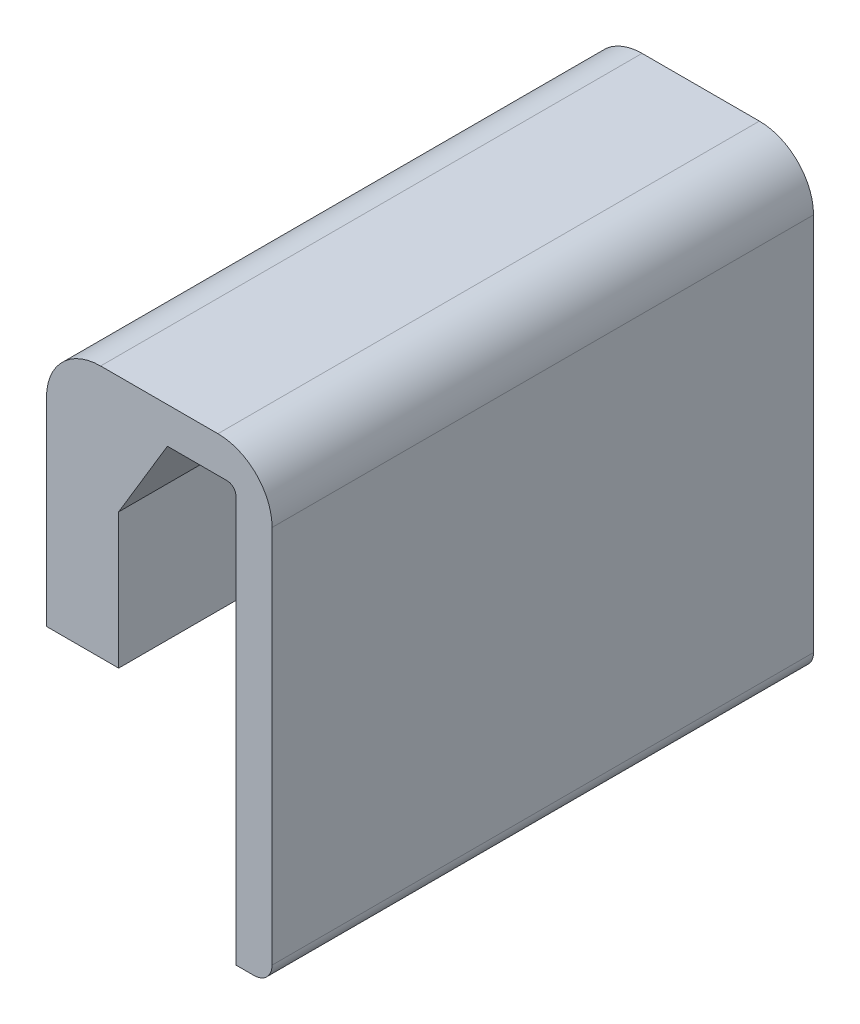
ISO-10303-21;
HEADER;
FILE_DESCRIPTION(('STEP AP214'),'2;1');
FILE_NAME('part.step','',(''),(''),'','','');
FILE_SCHEMA(('AUTOMOTIVE_DESIGN { 1 0 10303 214 1 1 1 1 }'));
ENDSEC;
DATA;
#1=APPLICATION_CONTEXT('core data for automotive mechanical design processes');
#2=APPLICATION_PROTOCOL_DEFINITION('international standard','automotive_design',2000,#1);
#3=PRODUCT_CONTEXT('',#1,'mechanical');
#4=PRODUCT('Part','Part','',(#3));
#5=PRODUCT_RELATED_PRODUCT_CATEGORY('part','',(#4));
#6=PRODUCT_DEFINITION_FORMATION('','',#4);
#7=PRODUCT_DEFINITION_CONTEXT('part definition',#1,'design');
#8=PRODUCT_DEFINITION('design','',#6,#7);
#9=PRODUCT_DEFINITION_SHAPE('','',#8);
#10=(LENGTH_UNIT() NAMED_UNIT(*) SI_UNIT(.MILLI.,.METRE.));
#11=(NAMED_UNIT(*) PLANE_ANGLE_UNIT() SI_UNIT($,.RADIAN.));
#12=(NAMED_UNIT(*) SI_UNIT($,.STERADIAN.) SOLID_ANGLE_UNIT());
#13=UNCERTAINTY_MEASURE_WITH_UNIT(LENGTH_MEASURE(1.E-05),#10,'distance_accuracy_value','');
#14=(GEOMETRIC_REPRESENTATION_CONTEXT(3) GLOBAL_UNCERTAINTY_ASSIGNED_CONTEXT((#13)) GLOBAL_UNIT_ASSIGNED_CONTEXT((#10,
#11,#12)) REPRESENTATION_CONTEXT('',''));
#15=CARTESIAN_POINT('',(0.,0.,0.));
#16=DIRECTION('',(0.,0.,1.));
#17=DIRECTION('',(1.,0.,0.));
#18=AXIS2_PLACEMENT_3D('',#15,#16,#17);
#19=CARTESIAN_POINT('',(3.99999999999999,43.5,30.));
#20=DIRECTION('',(-1.,0.,0.));
#21=DIRECTION('',(0.,-1.,0.));
#22=AXIS2_PLACEMENT_3D('',#19,#20,#21);
#23=PLANE('',#22);
#24=DIRECTION('',(0.,-0.948683298050514,0.316227766016838));
#25=VECTOR('',#24,1.);
#26=CARTESIAN_POINT('',(4.,37.35,11.55));
#27=LINE('',#26,#25);
#28=CARTESIAN_POINT('',(3.99999999999999,42.,10.));
#29=VERTEX_POINT('',#28);
#30=CARTESIAN_POINT('',(3.99999999999999,36.,12.));
#31=VERTEX_POINT('',#30);
#32=EDGE_CURVE('E191',#29,#31,#27,.T.);
#33=ORIENTED_EDGE('',*,*,#32,.T.);
#34=DIRECTION('',(0.,0.,-1.));
#35=VECTOR('',#34,1.);
#36=CARTESIAN_POINT('',(4.,36.,30.));
#37=LINE('',#36,#35);
#38=CARTESIAN_POINT('',(4.,36.,0.));
#39=VERTEX_POINT('',#38);
#40=EDGE_CURVE('E249',#31,#39,#37,.T.);
#41=ORIENTED_EDGE('',*,*,#40,.T.);
#42=DIRECTION('',(0.,1.,0.));
#43=VECTOR('',#42,1.);
#44=CARTESIAN_POINT('',(3.99999999999999,43.5,0.));
#45=LINE('',#44,#43);
#46=CARTESIAN_POINT('',(3.99999999999999,43.5,0.));
#47=VERTEX_POINT('',#46);
#48=EDGE_CURVE('E188',#39,#47,#45,.T.);
#49=ORIENTED_EDGE('',*,*,#48,.T.);
#50=DIRECTION('',(0.,0.,-1.));
#51=VECTOR('',#50,1.);
#52=CARTESIAN_POINT('',(3.99999999999999,43.5,30.));
#53=LINE('',#52,#51);
#54=CARTESIAN_POINT('',(3.99999999999999,43.5,30.));
#55=VERTEX_POINT('',#54);
#56=EDGE_CURVE('E210',#55,#47,#53,.T.);
#57=ORIENTED_EDGE('',*,*,#56,.F.);
#58=DIRECTION('',(0.,1.,0.));
#59=VECTOR('',#58,1.);
#60=CARTESIAN_POINT('',(3.99999999999999,43.5,30.));
#61=LINE('',#60,#59);
#62=CARTESIAN_POINT('',(4.,36.,30.));
#63=VERTEX_POINT('',#62);
#64=EDGE_CURVE('E206',#63,#55,#61,.T.);
#65=ORIENTED_EDGE('',*,*,#64,.F.);
#66=DIRECTION('',(0.,0.,-1.));
#67=VECTOR('',#66,1.);
#68=CARTESIAN_POINT('',(4.,36.,30.));
#69=LINE('',#68,#67);
#70=CARTESIAN_POINT('',(4.,36.,18.));
#71=VERTEX_POINT('',#70);
#72=EDGE_CURVE('E159',#63,#71,#69,.T.);
#73=ORIENTED_EDGE('',*,*,#72,.T.);
#74=DIRECTION('',(0.,0.948683298050514,0.316227766016838));
#75=VECTOR('',#74,1.);
#76=CARTESIAN_POINT('',(3.99999999999999,46.35,21.45));
#77=LINE('',#76,#75);
#78=CARTESIAN_POINT('',(4.,42.,20.));
#79=VERTEX_POINT('',#78);
#80=EDGE_CURVE('E316',#71,#79,#77,.T.);
#81=ORIENTED_EDGE('',*,*,#80,.T.);
#82=DIRECTION('',(0.,0.,-1.));
#83=VECTOR('',#82,1.);
#84=CARTESIAN_POINT('',(3.99999999999999,42.,30.));
#85=LINE('',#84,#83);
#86=EDGE_CURVE('E319',#79,#29,#85,.T.);
#87=ORIENTED_EDGE('',*,*,#86,.T.);
#88=EDGE_LOOP('',(#33,#41,#49,#57,#65,#73,#81,#87));
#89=FACE_BOUND('',#88,.T.);
#90=ADVANCED_FACE('F33',(#89),#23,.F.);
#91=CARTESIAN_POINT('',(6.69999999999999,48.,30.));
#92=DIRECTION('',(-0.857492925712544,0.514495755427527,0.));
#93=DIRECTION('',(-0.514495755427527,-0.857492925712544,0.));
#94=AXIS2_PLACEMENT_3D('',#91,#92,#93);
#95=PLANE('',#94);
#96=DIRECTION('',(0.514495755427527,0.857492925712544,0.));
#97=VECTOR('',#96,1.);
#98=CARTESIAN_POINT('',(6.69999999999999,48.,0.));
#99=LINE('',#98,#97);
#100=CARTESIAN_POINT('',(6.69999999999999,48.,0.));
#101=VERTEX_POINT('',#100);
#102=EDGE_CURVE('E190',#47,#101,#99,.T.);
#103=ORIENTED_EDGE('',*,*,#102,.T.);
#104=DIRECTION('',(0.,0.,-1.));
#105=VECTOR('',#104,1.);
#106=CARTESIAN_POINT('',(6.69999999999999,48.,30.));
#107=LINE('',#106,#105);
#108=CARTESIAN_POINT('',(6.69999999999999,48.,30.));
#109=VERTEX_POINT('',#108);
#110=EDGE_CURVE('E182',#109,#101,#107,.T.);
#111=ORIENTED_EDGE('',*,*,#110,.F.);
#112=DIRECTION('',(0.514495755427527,0.857492925712544,0.));
#113=VECTOR('',#112,1.);
#114=CARTESIAN_POINT('',(6.69999999999999,48.,30.));
#115=LINE('',#114,#113);
#116=EDGE_CURVE('E275',#55,#109,#115,.T.);
#117=ORIENTED_EDGE('',*,*,#116,.F.);
#118=ORIENTED_EDGE('',*,*,#56,.T.);
#119=EDGE_LOOP('',(#103,#111,#117,#118));
#120=FACE_BOUND('',#119,.T.);
#121=ADVANCED_FACE('F265',(#120),#95,.F.);
#122=CARTESIAN_POINT('',(10.5,48.,30.));
#123=DIRECTION('',(0.,1.,0.));
#124=DIRECTION('',(0.,0.,1.));
#125=AXIS2_PLACEMENT_3D('',#122,#123,#124);
#126=PLANE('',#125);
#127=DIRECTION('',(1.,0.,0.));
#128=VECTOR('',#127,1.);
#129=CARTESIAN_POINT('',(10.5,48.,0.));
#130=LINE('',#129,#128);
#131=CARTESIAN_POINT('',(9.99999999999999,48.,0.));
#132=VERTEX_POINT('',#131);
#133=EDGE_CURVE('E193',#101,#132,#130,.T.);
#134=ORIENTED_EDGE('',*,*,#133,.T.);
#135=DIRECTION('',(0.,0.,-1.));
#136=VECTOR('',#135,1.);
#137=CARTESIAN_POINT('',(9.99999999999999,48.,30.));
#138=LINE('',#137,#136);
#139=CARTESIAN_POINT('',(9.99999999999999,48.,30.));
#140=VERTEX_POINT('',#139);
#141=EDGE_CURVE('E234',#132,#140,#138,.F.);
#142=ORIENTED_EDGE('',*,*,#141,.T.);
#143=DIRECTION('',(1.,0.,0.));
#144=VECTOR('',#143,1.);
#145=CARTESIAN_POINT('',(10.5,48.,30.));
#146=LINE('',#145,#144);
#147=EDGE_CURVE('E272',#109,#140,#146,.T.);
#148=ORIENTED_EDGE('',*,*,#147,.F.);
#149=ORIENTED_EDGE('',*,*,#110,.T.);
#150=EDGE_LOOP('',(#134,#142,#148,#149));
#151=FACE_BOUND('',#150,.T.);
#152=ADVANCED_FACE('F269',(#151),#126,.F.);
#153=CARTESIAN_POINT('',(10.5,25.,30.));
#154=DIRECTION('',(1.,0.,0.));
#155=DIRECTION('',(0.,1.,0.));
#156=AXIS2_PLACEMENT_3D('',#153,#154,#155);
#157=PLANE('',#156);
#158=DIRECTION('',(0.,-1.,0.));
#159=VECTOR('',#158,1.);
#160=CARTESIAN_POINT('',(10.5,25.,30.));
#161=LINE('',#160,#159);
#162=CARTESIAN_POINT('',(10.5,47.5,30.));
#163=VERTEX_POINT('',#162);
#164=CARTESIAN_POINT('',(10.5,25.,30.));
#165=VERTEX_POINT('',#164);
#166=EDGE_CURVE('E274',#163,#165,#161,.T.);
#167=ORIENTED_EDGE('',*,*,#166,.F.);
#168=DIRECTION('',(0.,0.,-1.));
#169=VECTOR('',#168,1.);
#170=CARTESIAN_POINT('',(10.5,47.5,0.));
#171=LINE('',#170,#169);
#172=CARTESIAN_POINT('',(10.5,47.5,0.));
#173=VERTEX_POINT('',#172);
#174=EDGE_CURVE('E231',#163,#173,#171,.T.);
#175=ORIENTED_EDGE('',*,*,#174,.T.);
#176=DIRECTION('',(0.,-1.,0.));
#177=VECTOR('',#176,1.);
#178=CARTESIAN_POINT('',(10.5,25.,0.));
#179=LINE('',#178,#177);
#180=CARTESIAN_POINT('',(10.5,25.,0.));
#181=VERTEX_POINT('',#180);
#182=EDGE_CURVE('E196',#173,#181,#179,.T.);
#183=ORIENTED_EDGE('',*,*,#182,.T.);
#184=DIRECTION('',(0.,0.,-1.));
#185=VECTOR('',#184,1.);
#186=CARTESIAN_POINT('',(10.5,25.,30.));
#187=LINE('',#186,#185);
#188=EDGE_CURVE('E178',#165,#181,#187,.T.);
#189=ORIENTED_EDGE('',*,*,#188,.F.);
#190=EDGE_LOOP('',(#167,#175,#183,#189));
#191=FACE_BOUND('',#190,.T.);
#192=ADVANCED_FACE('F361',(#191),#157,.F.);
#193=CARTESIAN_POINT('',(12.5,25.,30.));
#194=DIRECTION('',(0.,1.,0.));
#195=DIRECTION('',(0.,0.,1.));
#196=AXIS2_PLACEMENT_3D('',#193,#194,#195);
#197=PLANE('',#196);
#198=DIRECTION('',(1.,0.,0.));
#199=VECTOR('',#198,1.);
#200=CARTESIAN_POINT('',(12.5,25.,0.));
#201=LINE('',#200,#199);
#202=CARTESIAN_POINT('',(11.5,25.,0.));
#203=VERTEX_POINT('',#202);
#204=EDGE_CURVE('E198',#181,#203,#201,.T.);
#205=ORIENTED_EDGE('',*,*,#204,.T.);
#206=DIRECTION('',(0.,0.,-1.));
#207=VECTOR('',#206,1.);
#208=CARTESIAN_POINT('',(11.5,25.,30.));
#209=LINE('',#208,#207);
#210=CARTESIAN_POINT('',(11.5,25.,30.));
#211=VERTEX_POINT('',#210);
#212=EDGE_CURVE('E56',#203,#211,#209,.F.);
#213=ORIENTED_EDGE('',*,*,#212,.T.);
#214=DIRECTION('',(1.,0.,0.));
#215=VECTOR('',#214,1.);
#216=CARTESIAN_POINT('',(12.5,25.,30.));
#217=LINE('',#216,#215);
#218=EDGE_CURVE('E277',#165,#211,#217,.T.);
#219=ORIENTED_EDGE('',*,*,#218,.F.);
#220=ORIENTED_EDGE('',*,*,#188,.T.);
#221=EDGE_LOOP('',(#205,#213,#219,#220));
#222=FACE_BOUND('',#221,.T.);
#223=ADVANCED_FACE('F364',(#222),#197,.F.);
#224=CARTESIAN_POINT('',(12.5,50.,30.));
#225=DIRECTION('',(-1.,0.,0.));
#226=DIRECTION('',(0.,-1.,0.));
#227=AXIS2_PLACEMENT_3D('',#224,#225,#226);
#228=PLANE('',#227);
#229=DIRECTION('',(0.,1.,0.));
#230=VECTOR('',#229,1.);
#231=CARTESIAN_POINT('',(12.5,50.,30.));
#232=LINE('',#231,#230);
#233=CARTESIAN_POINT('',(12.5,26.,30.));
#234=VERTEX_POINT('',#233);
#235=CARTESIAN_POINT('',(12.5,47.,30.));
#236=VERTEX_POINT('',#235);
#237=EDGE_CURVE('E184',#234,#236,#232,.T.);
#238=ORIENTED_EDGE('',*,*,#237,.F.);
#239=DIRECTION('',(0.,0.,-1.));
#240=VECTOR('',#239,1.);
#241=CARTESIAN_POINT('',(12.5,26.,30.));
#242=LINE('',#241,#240);
#243=CARTESIAN_POINT('',(12.5,26.,0.));
#244=VERTEX_POINT('',#243);
#245=EDGE_CURVE('E240',#234,#244,#242,.T.);
#246=ORIENTED_EDGE('',*,*,#245,.T.);
#247=DIRECTION('',(0.,1.,0.));
#248=VECTOR('',#247,1.);
#249=CARTESIAN_POINT('',(12.5,50.,0.));
#250=LINE('',#249,#248);
#251=CARTESIAN_POINT('',(12.5,47.,0.));
#252=VERTEX_POINT('',#251);
#253=EDGE_CURVE('E200',#244,#252,#250,.T.);
#254=ORIENTED_EDGE('',*,*,#253,.T.);
#255=DIRECTION('',(0.,0.,-1.));
#256=VECTOR('',#255,1.);
#257=CARTESIAN_POINT('',(12.5,47.,30.));
#258=LINE('',#257,#256);
#259=EDGE_CURVE('E223',#252,#236,#258,.F.);
#260=ORIENTED_EDGE('',*,*,#259,.T.);
#261=EDGE_LOOP('',(#238,#246,#254,#260));
#262=FACE_BOUND('',#261,.T.);
#263=ADVANCED_FACE('F289',(#262),#228,.F.);
#264=CARTESIAN_POINT('',(0.,50.,30.));
#265=DIRECTION('',(0.,-1.,0.));
#266=DIRECTION('',(0.,0.,-1.));
#267=AXIS2_PLACEMENT_3D('',#264,#265,#266);
#268=PLANE('',#267);
#269=DIRECTION('',(-1.,0.,0.));
#270=VECTOR('',#269,1.);
#271=CARTESIAN_POINT('',(0.,50.,30.));
#272=LINE('',#271,#270);
#273=CARTESIAN_POINT('',(9.49999999999999,50.,30.));
#274=VERTEX_POINT('',#273);
#275=CARTESIAN_POINT('',(3.,50.,30.));
#276=VERTEX_POINT('',#275);
#277=EDGE_CURVE('E179',#274,#276,#272,.T.);
#278=ORIENTED_EDGE('',*,*,#277,.F.);
#279=DIRECTION('',(0.,0.,-1.));
#280=VECTOR('',#279,1.);
#281=CARTESIAN_POINT('',(9.49999999999999,50.,30.));
#282=LINE('',#281,#280);
#283=CARTESIAN_POINT('',(9.49999999999999,50.,0.));
#284=VERTEX_POINT('',#283);
#285=EDGE_CURVE('E215',#274,#284,#282,.T.);
#286=ORIENTED_EDGE('',*,*,#285,.T.);
#287=DIRECTION('',(-1.,0.,0.));
#288=VECTOR('',#287,1.);
#289=CARTESIAN_POINT('',(0.,50.,0.));
#290=LINE('',#289,#288);
#291=CARTESIAN_POINT('',(3.,50.,0.));
#292=VERTEX_POINT('',#291);
#293=EDGE_CURVE('E202',#284,#292,#290,.T.);
#294=ORIENTED_EDGE('',*,*,#293,.T.);
#295=DIRECTION('',(0.,0.,-1.));
#296=VECTOR('',#295,1.);
#297=CARTESIAN_POINT('',(3.,50.,30.));
#298=LINE('',#297,#296);
#299=EDGE_CURVE('E213',#292,#276,#298,.F.);
#300=ORIENTED_EDGE('',*,*,#299,.T.);
#301=EDGE_LOOP('',(#278,#286,#294,#300));
#302=FACE_BOUND('',#301,.T.);
#303=ADVANCED_FACE('F296',(#302),#268,.F.);
#304=CARTESIAN_POINT('',(0.,0.,30.));
#305=DIRECTION('',(1.,0.,0.));
#306=DIRECTION('',(0.,0.,-1.));
#307=AXIS2_PLACEMENT_3D('',#304,#305,#306);
#308=PLANE('',#307);
#309=DIRECTION('',(0.,-1.,0.));
#310=VECTOR('',#309,1.);
#311=CARTESIAN_POINT('',(0.,0.,0.));
#312=LINE('',#311,#310);
#313=CARTESIAN_POINT('',(0.,47.,0.));
#314=VERTEX_POINT('',#313);
#315=CARTESIAN_POINT('',(0.,36.,0.));
#316=VERTEX_POINT('',#315);
#317=EDGE_CURVE('E205',#314,#316,#312,.T.);
#318=ORIENTED_EDGE('',*,*,#317,.T.);
#319=DIRECTION('',(0.,0.,-1.));
#320=VECTOR('',#319,1.);
#321=CARTESIAN_POINT('',(0.,36.,0.));
#322=LINE('',#321,#320);
#323=CARTESIAN_POINT('',(0.,36.,12.));
#324=VERTEX_POINT('',#323);
#325=EDGE_CURVE('E48',#324,#316,#322,.T.);
#326=ORIENTED_EDGE('',*,*,#325,.F.);
#327=DIRECTION('',(0.,-0.948683298050514,0.316227766016838));
#328=VECTOR('',#327,1.);
#329=CARTESIAN_POINT('',(0.,36.,12.));
#330=LINE('',#329,#328);
#331=CARTESIAN_POINT('',(0.,42.,10.));
#332=VERTEX_POINT('',#331);
#333=EDGE_CURVE('E302',#332,#324,#330,.T.);
#334=ORIENTED_EDGE('',*,*,#333,.F.);
#335=DIRECTION('',(0.,0.,-1.));
#336=VECTOR('',#335,1.);
#337=CARTESIAN_POINT('',(0.,42.,10.));
#338=LINE('',#337,#336);
#339=CARTESIAN_POINT('',(0.,42.,20.));
#340=VERTEX_POINT('',#339);
#341=EDGE_CURVE('E307',#340,#332,#338,.T.);
#342=ORIENTED_EDGE('',*,*,#341,.F.);
#343=DIRECTION('',(0.,0.948683298050514,0.316227766016838));
#344=VECTOR('',#343,1.);
#345=CARTESIAN_POINT('',(0.,36.,18.));
#346=LINE('',#345,#344);
#347=CARTESIAN_POINT('',(0.,36.,18.));
#348=VERTEX_POINT('',#347);
#349=EDGE_CURVE('E172',#348,#340,#346,.T.);
#350=ORIENTED_EDGE('',*,*,#349,.F.);
#351=DIRECTION('',(0.,0.,-1.));
#352=VECTOR('',#351,1.);
#353=CARTESIAN_POINT('',(0.,36.,18.));
#354=LINE('',#353,#352);
#355=CARTESIAN_POINT('',(0.,36.,30.));
#356=VERTEX_POINT('',#355);
#357=EDGE_CURVE('E156',#356,#348,#354,.T.);
#358=ORIENTED_EDGE('',*,*,#357,.F.);
#359=DIRECTION('',(0.,-1.,0.));
#360=VECTOR('',#359,1.);
#361=CARTESIAN_POINT('',(0.,0.,30.));
#362=LINE('',#361,#360);
#363=CARTESIAN_POINT('',(0.,47.,30.));
#364=VERTEX_POINT('',#363);
#365=EDGE_CURVE('E168',#364,#356,#362,.T.);
#366=ORIENTED_EDGE('',*,*,#365,.F.);
#367=DIRECTION('',(0.,0.,-1.));
#368=VECTOR('',#367,1.);
#369=CARTESIAN_POINT('',(0.,47.,30.));
#370=LINE('',#369,#368);
#371=EDGE_CURVE('E229',#364,#314,#370,.T.);
#372=ORIENTED_EDGE('',*,*,#371,.T.);
#373=EDGE_LOOP('',(#318,#326,#334,#342,#350,#358,#366,#372));
#374=FACE_BOUND('',#373,.T.);
#375=ADVANCED_FACE('F166',(#374),#308,.F.);
#376=CARTESIAN_POINT('',(0.,0.,30.));
#377=DIRECTION('',(0.,0.,-1.));
#378=DIRECTION('',(-1.,0.,0.));
#379=AXIS2_PLACEMENT_3D('',#376,#377,#378);
#380=PLANE('',#379);
#381=ORIENTED_EDGE('',*,*,#365,.T.);
#382=DIRECTION('',(1.,0.,0.));
#383=VECTOR('',#382,1.);
#384=CARTESIAN_POINT('',(0.,36.,30.));
#385=LINE('',#384,#383);
#386=EDGE_CURVE('E11',#356,#63,#385,.T.);
#387=ORIENTED_EDGE('',*,*,#386,.T.);
#388=ORIENTED_EDGE('',*,*,#64,.T.);
#389=ORIENTED_EDGE('',*,*,#116,.T.);
#390=ORIENTED_EDGE('',*,*,#147,.T.);
#391=CARTESIAN_POINT('',(9.99999999999999,47.5,30.));
#392=DIRECTION('',(0.,0.,-1.));
#393=DIRECTION('',(-1.,0.,0.));
#394=AXIS2_PLACEMENT_3D('',#391,#392,#393);
#395=CIRCLE('',#394,0.5);
#396=EDGE_CURVE('E238',#140,#163,#395,.T.);
#397=ORIENTED_EDGE('',*,*,#396,.T.);
#398=ORIENTED_EDGE('',*,*,#166,.T.);
#399=ORIENTED_EDGE('',*,*,#218,.T.);
#400=CARTESIAN_POINT('',(11.5,26.,30.));
#401=DIRECTION('',(0.,0.,-1.));
#402=DIRECTION('',(-1.,0.,0.));
#403=AXIS2_PLACEMENT_3D('',#400,#401,#402);
#404=CIRCLE('',#403,1.);
#405=EDGE_CURVE('E246',#211,#234,#404,.F.);
#406=ORIENTED_EDGE('',*,*,#405,.T.);
#407=ORIENTED_EDGE('',*,*,#237,.T.);
#408=CARTESIAN_POINT('',(9.49999999999999,47.,30.));
#409=DIRECTION('',(0.,0.,-1.));
#410=DIRECTION('',(-1.,0.,0.));
#411=AXIS2_PLACEMENT_3D('',#408,#409,#410);
#412=CIRCLE('',#411,3.);
#413=EDGE_CURVE('E227',#236,#274,#412,.F.);
#414=ORIENTED_EDGE('',*,*,#413,.T.);
#415=ORIENTED_EDGE('',*,*,#277,.T.);
#416=CARTESIAN_POINT('',(3.,47.,30.));
#417=DIRECTION('',(0.,0.,-1.));
#418=DIRECTION('',(-1.,0.,0.));
#419=AXIS2_PLACEMENT_3D('',#416,#417,#418);
#420=CIRCLE('',#419,3.);
#421=EDGE_CURVE('E177',#276,#364,#420,.F.);
#422=ORIENTED_EDGE('',*,*,#421,.T.);
#423=EDGE_LOOP('',(#381,#387,#388,#389,#390,#397,#398,#399,#406,#407,#414,#415,#422));
#424=FACE_BOUND('',#423,.T.);
#425=ADVANCED_FACE('F174',(#424),#380,.F.);
#426=CARTESIAN_POINT('',(0.,0.,0.));
#427=DIRECTION('',(0.,0.,-1.));
#428=DIRECTION('',(-1.,0.,0.));
#429=AXIS2_PLACEMENT_3D('',#426,#427,#428);
#430=PLANE('',#429);
#431=DIRECTION('',(1.,0.,0.));
#432=VECTOR('',#431,1.);
#433=CARTESIAN_POINT('',(0.,36.,0.));
#434=LINE('',#433,#432);
#435=EDGE_CURVE('E41',#316,#39,#434,.T.);
#436=ORIENTED_EDGE('',*,*,#435,.F.);
#437=ORIENTED_EDGE('',*,*,#317,.F.);
#438=CARTESIAN_POINT('',(3.,47.,0.));
#439=DIRECTION('',(0.,0.,-1.));
#440=DIRECTION('',(-1.,0.,0.));
#441=AXIS2_PLACEMENT_3D('',#438,#439,#440);
#442=CIRCLE('',#441,3.);
#443=EDGE_CURVE('E218',#314,#292,#442,.T.);
#444=ORIENTED_EDGE('',*,*,#443,.T.);
#445=ORIENTED_EDGE('',*,*,#293,.F.);
#446=CARTESIAN_POINT('',(9.49999999999999,47.,0.));
#447=DIRECTION('',(0.,0.,-1.));
#448=DIRECTION('',(-1.,0.,0.));
#449=AXIS2_PLACEMENT_3D('',#446,#447,#448);
#450=CIRCLE('',#449,3.);
#451=EDGE_CURVE('E220',#284,#252,#450,.T.);
#452=ORIENTED_EDGE('',*,*,#451,.T.);
#453=ORIENTED_EDGE('',*,*,#253,.F.);
#454=CARTESIAN_POINT('',(11.5,26.,0.));
#455=DIRECTION('',(0.,0.,-1.));
#456=DIRECTION('',(-1.,0.,0.));
#457=AXIS2_PLACEMENT_3D('',#454,#455,#456);
#458=CIRCLE('',#457,1.);
#459=EDGE_CURVE('E243',#244,#203,#458,.T.);
#460=ORIENTED_EDGE('',*,*,#459,.T.);
#461=ORIENTED_EDGE('',*,*,#204,.F.);
#462=ORIENTED_EDGE('',*,*,#182,.F.);
#463=CARTESIAN_POINT('',(9.99999999999999,47.5,0.));
#464=DIRECTION('',(0.,0.,-1.));
#465=DIRECTION('',(-1.,0.,0.));
#466=AXIS2_PLACEMENT_3D('',#463,#464,#465);
#467=CIRCLE('',#466,0.5);
#468=EDGE_CURVE('E236',#173,#132,#467,.F.);
#469=ORIENTED_EDGE('',*,*,#468,.T.);
#470=ORIENTED_EDGE('',*,*,#133,.F.);
#471=ORIENTED_EDGE('',*,*,#102,.F.);
#472=ORIENTED_EDGE('',*,*,#48,.F.);
#473=EDGE_LOOP('',(#436,#437,#444,#445,#452,#453,#460,#461,#462,#469,#470,#471,#472));
#474=FACE_BOUND('',#473,.T.);
#475=ADVANCED_FACE('F261',(#474),#430,.T.);
#476=CARTESIAN_POINT('',(9.49999999999999,47.,30.));
#477=DIRECTION('',(0.,0.,-1.));
#478=DIRECTION('',(-1.,0.,0.));
#479=AXIS2_PLACEMENT_3D('',#476,#477,#478);
#480=CYLINDRICAL_SURFACE('',#479,3.);
#481=ORIENTED_EDGE('',*,*,#413,.F.);
#482=ORIENTED_EDGE('',*,*,#259,.F.);
#483=ORIENTED_EDGE('',*,*,#451,.F.);
#484=ORIENTED_EDGE('',*,*,#285,.F.);
#485=EDGE_LOOP('',(#481,#482,#483,#484));
#486=FACE_BOUND('',#485,.T.);
#487=ADVANCED_FACE('F293',(#486),#480,.T.);
#488=CARTESIAN_POINT('',(3.,47.,30.));
#489=DIRECTION('',(0.,0.,-1.));
#490=DIRECTION('',(-1.,0.,0.));
#491=AXIS2_PLACEMENT_3D('',#488,#489,#490);
#492=CYLINDRICAL_SURFACE('',#491,3.);
#493=ORIENTED_EDGE('',*,*,#421,.F.);
#494=ORIENTED_EDGE('',*,*,#299,.F.);
#495=ORIENTED_EDGE('',*,*,#443,.F.);
#496=ORIENTED_EDGE('',*,*,#371,.F.);
#497=EDGE_LOOP('',(#493,#494,#495,#496));
#498=FACE_BOUND('',#497,.T.);
#499=ADVANCED_FACE('F299',(#498),#492,.T.);
#500=CARTESIAN_POINT('',(9.99999999999999,47.5,30.));
#501=DIRECTION('',(0.,0.,1.));
#502=DIRECTION('',(1.,0.,0.));
#503=AXIS2_PLACEMENT_3D('',#500,#501,#502);
#504=CYLINDRICAL_SURFACE('',#503,0.5);
#505=ORIENTED_EDGE('',*,*,#396,.F.);
#506=ORIENTED_EDGE('',*,*,#141,.F.);
#507=ORIENTED_EDGE('',*,*,#468,.F.);
#508=ORIENTED_EDGE('',*,*,#174,.F.);
#509=EDGE_LOOP('',(#505,#506,#507,#508));
#510=FACE_BOUND('',#509,.T.);
#511=ADVANCED_FACE('F337',(#510),#504,.F.);
#512=CARTESIAN_POINT('',(11.5,26.,30.));
#513=DIRECTION('',(0.,0.,-1.));
#514=DIRECTION('',(-1.,0.,0.));
#515=AXIS2_PLACEMENT_3D('',#512,#513,#514);
#516=CYLINDRICAL_SURFACE('',#515,1.);
#517=ORIENTED_EDGE('',*,*,#405,.F.);
#518=ORIENTED_EDGE('',*,*,#212,.F.);
#519=ORIENTED_EDGE('',*,*,#459,.F.);
#520=ORIENTED_EDGE('',*,*,#245,.F.);
#521=EDGE_LOOP('',(#517,#518,#519,#520));
#522=FACE_BOUND('',#521,.T.);
#523=ADVANCED_FACE('F35',(#522),#516,.T.);
#524=CARTESIAN_POINT('',(10.,36.,12.));
#525=DIRECTION('',(0.,-0.316227766016838,-0.948683298050514));
#526=DIRECTION('',(0.,0.948683298050514,-0.316227766016838));
#527=AXIS2_PLACEMENT_3D('',#524,#525,#526);
#528=PLANE('',#527);
#529=DIRECTION('',(-1.,0.,0.));
#530=VECTOR('',#529,1.);
#531=CARTESIAN_POINT('',(10.,42.,10.));
#532=LINE('',#531,#530);
#533=EDGE_CURVE('E312',#29,#332,#532,.T.);
#534=ORIENTED_EDGE('',*,*,#533,.T.);
#535=ORIENTED_EDGE('',*,*,#333,.T.);
#536=DIRECTION('',(-1.,0.,0.));
#537=VECTOR('',#536,1.);
#538=CARTESIAN_POINT('',(10.,36.,12.));
#539=LINE('',#538,#537);
#540=EDGE_CURVE('E258',#31,#324,#539,.T.);
#541=ORIENTED_EDGE('',*,*,#540,.F.);
#542=ORIENTED_EDGE('',*,*,#32,.F.);
#543=EDGE_LOOP('',(#534,#535,#541,#542));
#544=FACE_BOUND('',#543,.T.);
#545=ADVANCED_FACE('F329',(#544),#528,.F.);
#546=CARTESIAN_POINT('',(10.,42.,10.));
#547=DIRECTION('',(0.,1.,0.));
#548=DIRECTION('',(0.,0.,1.));
#549=AXIS2_PLACEMENT_3D('',#546,#547,#548);
#550=PLANE('',#549);
#551=DIRECTION('',(-1.,0.,0.));
#552=VECTOR('',#551,1.);
#553=CARTESIAN_POINT('',(10.,42.,20.));
#554=LINE('',#553,#552);
#555=EDGE_CURVE('E305',#79,#340,#554,.T.);
#556=ORIENTED_EDGE('',*,*,#555,.T.);
#557=ORIENTED_EDGE('',*,*,#341,.T.);
#558=ORIENTED_EDGE('',*,*,#533,.F.);
#559=ORIENTED_EDGE('',*,*,#86,.F.);
#560=EDGE_LOOP('',(#556,#557,#558,#559));
#561=FACE_BOUND('',#560,.T.);
#562=ADVANCED_FACE('F326',(#561),#550,.F.);
#563=CARTESIAN_POINT('',(10.,36.,18.));
#564=DIRECTION('',(0.,-0.316227766016838,0.948683298050514));
#565=DIRECTION('',(0.,-0.948683298050514,-0.316227766016838));
#566=AXIS2_PLACEMENT_3D('',#563,#564,#565);
#567=PLANE('',#566);
#568=DIRECTION('',(-1.,0.,0.));
#569=VECTOR('',#568,1.);
#570=CARTESIAN_POINT('',(10.,36.,18.));
#571=LINE('',#570,#569);
#572=EDGE_CURVE('E303',#71,#348,#571,.T.);
#573=ORIENTED_EDGE('',*,*,#572,.T.);
#574=ORIENTED_EDGE('',*,*,#349,.T.);
#575=ORIENTED_EDGE('',*,*,#555,.F.);
#576=ORIENTED_EDGE('',*,*,#80,.F.);
#577=EDGE_LOOP('',(#573,#574,#575,#576));
#578=FACE_BOUND('',#577,.T.);
#579=ADVANCED_FACE('F323',(#578),#567,.F.);
#580=CARTESIAN_POINT('',(10.,36.,18.));
#581=DIRECTION('',(0.,1.,0.));
#582=DIRECTION('',(0.,0.,1.));
#583=AXIS2_PLACEMENT_3D('',#580,#581,#582);
#584=PLANE('',#583);
#585=ORIENTED_EDGE('',*,*,#386,.F.);
#586=ORIENTED_EDGE('',*,*,#357,.T.);
#587=ORIENTED_EDGE('',*,*,#572,.F.);
#588=ORIENTED_EDGE('',*,*,#72,.F.);
#589=EDGE_LOOP('',(#585,#586,#587,#588));
#590=FACE_BOUND('',#589,.T.);
#591=ADVANCED_FACE('F154',(#590),#584,.F.);
#592=CARTESIAN_POINT('',(10.,36.,0.));
#593=DIRECTION('',(0.,1.,0.));
#594=DIRECTION('',(0.,0.,1.));
#595=AXIS2_PLACEMENT_3D('',#592,#593,#594);
#596=PLANE('',#595);
#597=ORIENTED_EDGE('',*,*,#540,.T.);
#598=ORIENTED_EDGE('',*,*,#325,.T.);
#599=ORIENTED_EDGE('',*,*,#435,.T.);
#600=ORIENTED_EDGE('',*,*,#40,.F.);
#601=EDGE_LOOP('',(#597,#598,#599,#600));
#602=FACE_BOUND('',#601,.T.);
#603=ADVANCED_FACE('F248',(#602),#596,.F.);
#604=CLOSED_SHELL('',(#90,#121,#152,#192,#223,#263,#303,#375,#425,#475,#487,#499,#511,#523,#545,
#562,#579,#591,#603));
#605=MANIFOLD_SOLID_BREP('B2',#604);
#606=ADVANCED_BREP_SHAPE_REPRESENTATION('',(#18,#605),#14);
#607=SHAPE_DEFINITION_REPRESENTATION(#9,#606);
ENDSEC;
END-ISO-10303-21;
